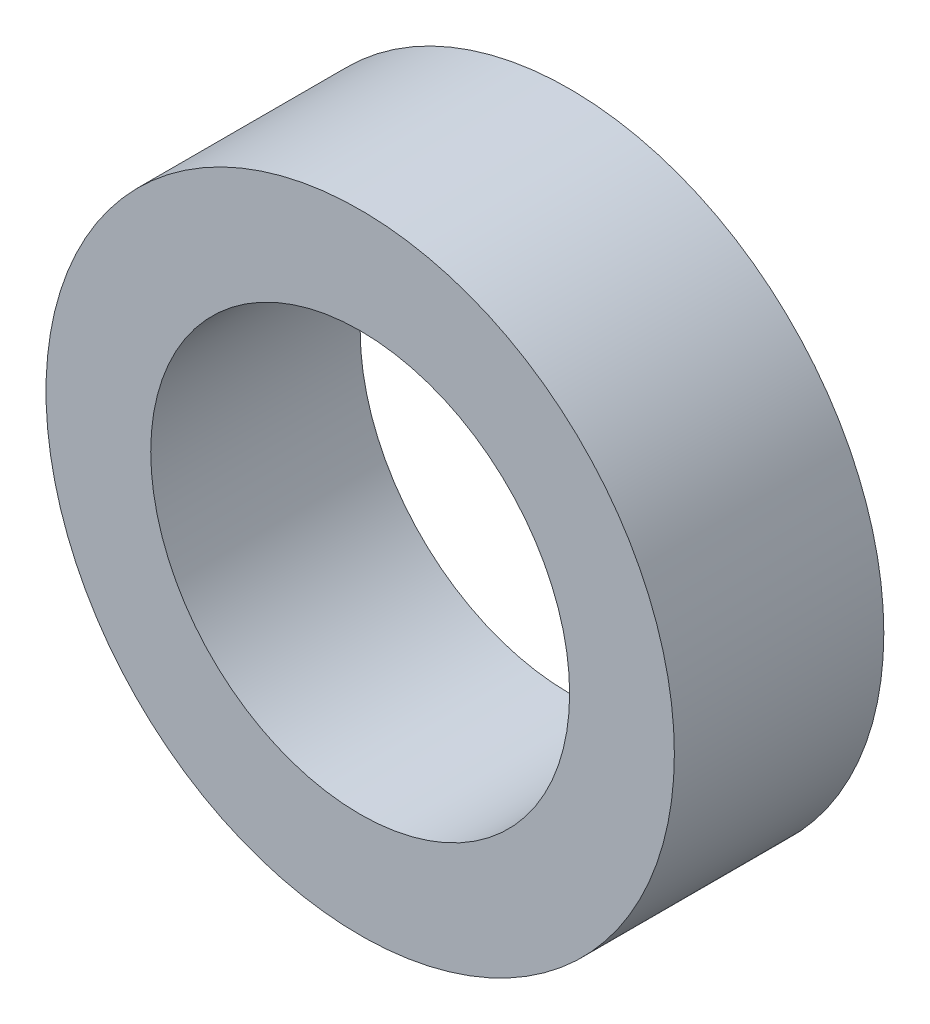
ISO-10303-21;
HEADER;
FILE_DESCRIPTION(('STEP AP214'),'2;1');
FILE_NAME('part.step','',(''),(''),'','','');
FILE_SCHEMA(('AUTOMOTIVE_DESIGN { 1 0 10303 214 1 1 1 1 }'));
ENDSEC;
DATA;
#1=APPLICATION_CONTEXT('core data for automotive mechanical design processes');
#2=APPLICATION_PROTOCOL_DEFINITION('international standard','automotive_design',2000,#1);
#3=PRODUCT_CONTEXT('',#1,'mechanical');
#4=PRODUCT('Part','Part','',(#3));
#5=PRODUCT_RELATED_PRODUCT_CATEGORY('part','',(#4));
#6=PRODUCT_DEFINITION_FORMATION('','',#4);
#7=PRODUCT_DEFINITION_CONTEXT('part definition',#1,'design');
#8=PRODUCT_DEFINITION('design','',#6,#7);
#9=PRODUCT_DEFINITION_SHAPE('','',#8);
#10=(LENGTH_UNIT() NAMED_UNIT(*) SI_UNIT(.MILLI.,.METRE.));
#11=(NAMED_UNIT(*) PLANE_ANGLE_UNIT() SI_UNIT($,.RADIAN.));
#12=(NAMED_UNIT(*) SI_UNIT($,.STERADIAN.) SOLID_ANGLE_UNIT());
#13=UNCERTAINTY_MEASURE_WITH_UNIT(LENGTH_MEASURE(1.E-05),#10,'distance_accuracy_value','');
#14=(GEOMETRIC_REPRESENTATION_CONTEXT(3) GLOBAL_UNCERTAINTY_ASSIGNED_CONTEXT((#13)) GLOBAL_UNIT_ASSIGNED_CONTEXT((#10,
#11,#12)) REPRESENTATION_CONTEXT('',''));
#15=CARTESIAN_POINT('',(0.,0.,0.));
#16=DIRECTION('',(0.,0.,1.));
#17=DIRECTION('',(1.,0.,0.));
#18=AXIS2_PLACEMENT_3D('',#15,#16,#17);
#19=CARTESIAN_POINT('',(0.,0.,4.));
#20=DIRECTION('',(0.,0.,1.));
#21=DIRECTION('',(1.,0.,0.));
#22=AXIS2_PLACEMENT_3D('',#19,#20,#21);
#23=PLANE('',#22);
#24=CARTESIAN_POINT('',(0.,0.,4.));
#25=DIRECTION('',(0.,0.,1.));
#26=DIRECTION('',(1.,0.,0.));
#27=AXIS2_PLACEMENT_3D('',#24,#25,#26);
#28=CIRCLE('',#27,6.);
#29=CARTESIAN_POINT('',(6.,0.,4.));
#30=VERTEX_POINT('',#29);
#31=EDGE_CURVE('E11',#30,#30,#28,.T.);
#32=ORIENTED_EDGE('',*,*,#31,.T.);
#33=EDGE_LOOP('',(#32));
#34=FACE_BOUND('',#33,.T.);
#35=CARTESIAN_POINT('',(0.,0.,4.));
#36=DIRECTION('',(0.,0.,1.));
#37=DIRECTION('',(1.,0.,0.));
#38=AXIS2_PLACEMENT_3D('',#35,#36,#37);
#39=CIRCLE('',#38,4.);
#40=CARTESIAN_POINT('',(4.,0.,4.));
#41=VERTEX_POINT('',#40);
#42=EDGE_CURVE('E61',#41,#41,#39,.T.);
#43=ORIENTED_EDGE('',*,*,#42,.F.);
#44=EDGE_LOOP('',(#43));
#45=FACE_BOUND('',#44,.T.);
#46=ADVANCED_FACE('F51',(#34,#45),#23,.T.);
#47=CARTESIAN_POINT('',(0.,0.,0.));
#48=DIRECTION('',(0.,0.,1.));
#49=DIRECTION('',(1.,0.,0.));
#50=AXIS2_PLACEMENT_3D('',#47,#48,#49);
#51=PLANE('',#50);
#52=CARTESIAN_POINT('',(0.,0.,0.));
#53=DIRECTION('',(0.,0.,1.));
#54=DIRECTION('',(1.,0.,0.));
#55=AXIS2_PLACEMENT_3D('',#52,#53,#54);
#56=CIRCLE('',#55,6.);
#57=CARTESIAN_POINT('',(6.,0.,0.));
#58=VERTEX_POINT('',#57);
#59=EDGE_CURVE('E54',#58,#58,#56,.T.);
#60=ORIENTED_EDGE('',*,*,#59,.F.);
#61=EDGE_LOOP('',(#60));
#62=FACE_BOUND('',#61,.T.);
#63=CARTESIAN_POINT('',(0.,0.,0.));
#64=DIRECTION('',(0.,0.,1.));
#65=DIRECTION('',(1.,0.,0.));
#66=AXIS2_PLACEMENT_3D('',#63,#64,#65);
#67=CIRCLE('',#66,4.);
#68=CARTESIAN_POINT('',(4.,0.,0.));
#69=VERTEX_POINT('',#68);
#70=EDGE_CURVE('E67',#69,#69,#67,.T.);
#71=ORIENTED_EDGE('',*,*,#70,.T.);
#72=EDGE_LOOP('',(#71));
#73=FACE_BOUND('',#72,.T.);
#74=ADVANCED_FACE('F79',(#62,#73),#51,.F.);
#75=CARTESIAN_POINT('',(0.,0.,4.));
#76=DIRECTION('',(0.,0.,-1.));
#77=DIRECTION('',(-1.,0.,0.));
#78=AXIS2_PLACEMENT_3D('',#75,#76,#77);
#79=CYLINDRICAL_SURFACE('',#78,6.);
#80=ORIENTED_EDGE('',*,*,#31,.F.);
#81=EDGE_LOOP('',(#80));
#82=FACE_BOUND('',#81,.T.);
#83=ORIENTED_EDGE('',*,*,#59,.T.);
#84=EDGE_LOOP('',(#83));
#85=FACE_BOUND('',#84,.T.);
#86=ADVANCED_FACE('F52',(#82,#85),#79,.T.);
#87=CARTESIAN_POINT('',(0.,0.,4.));
#88=DIRECTION('',(0.,0.,-1.));
#89=DIRECTION('',(-1.,0.,0.));
#90=AXIS2_PLACEMENT_3D('',#87,#88,#89);
#91=CYLINDRICAL_SURFACE('',#90,4.);
#92=ORIENTED_EDGE('',*,*,#42,.T.);
#93=EDGE_LOOP('',(#92));
#94=FACE_BOUND('',#93,.T.);
#95=ORIENTED_EDGE('',*,*,#70,.F.);
#96=EDGE_LOOP('',(#95));
#97=FACE_BOUND('',#96,.T.);
#98=ADVANCED_FACE('F74',(#94,#97),#91,.F.);
#99=CLOSED_SHELL('',(#46,#74,#86,#98));
#100=MANIFOLD_SOLID_BREP('B2',#99);
#101=ADVANCED_BREP_SHAPE_REPRESENTATION('',(#18,#100),#14);
#102=SHAPE_DEFINITION_REPRESENTATION(#9,#101);
ENDSEC;
END-ISO-10303-21;
